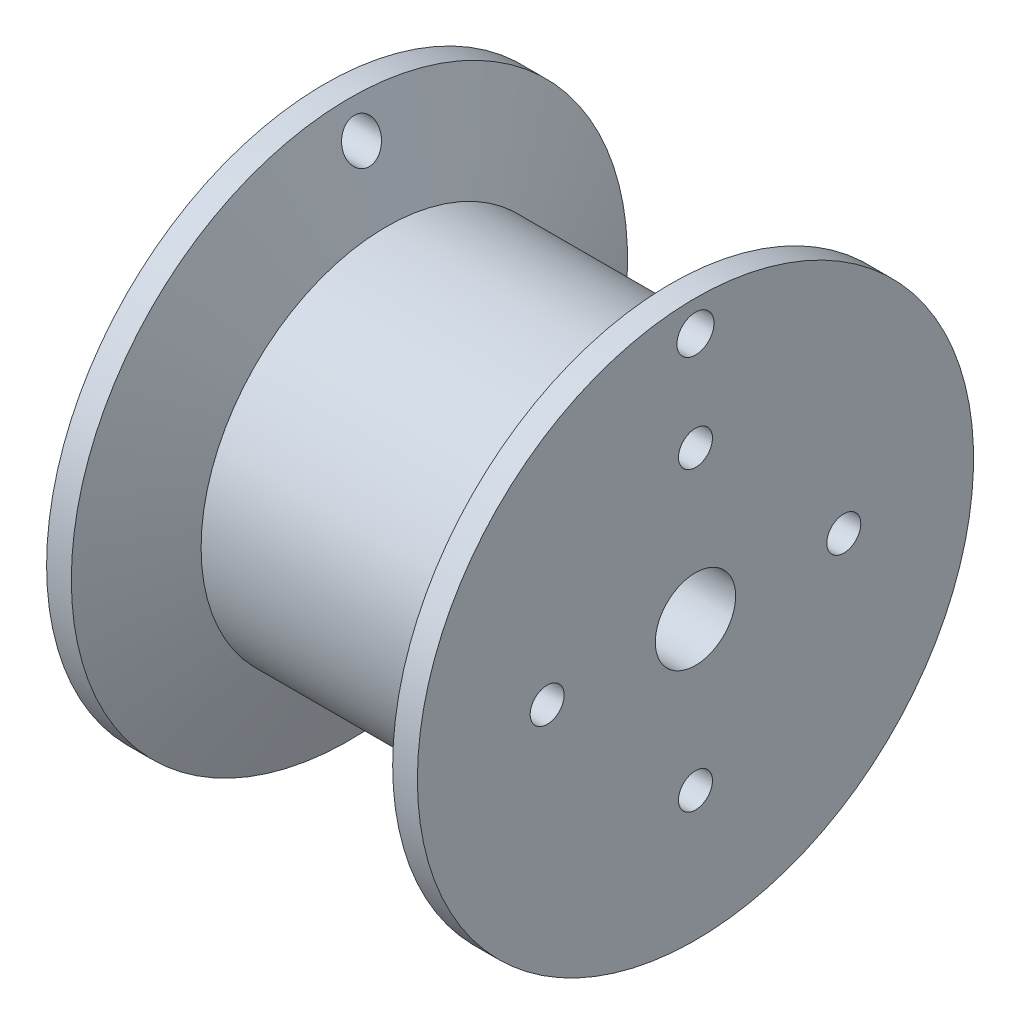
ISO-10303-21;
HEADER;
FILE_DESCRIPTION(('STEP AP214'),'2;1');
FILE_NAME('part.step','',(''),(''),'','','');
FILE_SCHEMA(('AUTOMOTIVE_DESIGN { 1 0 10303 214 1 1 1 1 }'));
ENDSEC;
DATA;
#1=APPLICATION_CONTEXT('core data for automotive mechanical design processes');
#2=APPLICATION_PROTOCOL_DEFINITION('international standard','automotive_design',2000,#1);
#3=PRODUCT_CONTEXT('',#1,'mechanical');
#4=PRODUCT('Part','Part','',(#3));
#5=PRODUCT_RELATED_PRODUCT_CATEGORY('part','',(#4));
#6=PRODUCT_DEFINITION_FORMATION('','',#4);
#7=PRODUCT_DEFINITION_CONTEXT('part definition',#1,'design');
#8=PRODUCT_DEFINITION('design','',#6,#7);
#9=PRODUCT_DEFINITION_SHAPE('','',#8);
#10=(LENGTH_UNIT() NAMED_UNIT(*) SI_UNIT(.MILLI.,.METRE.));
#11=(NAMED_UNIT(*) PLANE_ANGLE_UNIT() SI_UNIT($,.RADIAN.));
#12=(NAMED_UNIT(*) SI_UNIT($,.STERADIAN.) SOLID_ANGLE_UNIT());
#13=UNCERTAINTY_MEASURE_WITH_UNIT(LENGTH_MEASURE(1.E-05),#10,'distance_accuracy_value','');
#14=(GEOMETRIC_REPRESENTATION_CONTEXT(3) GLOBAL_UNCERTAINTY_ASSIGNED_CONTEXT((#13)) GLOBAL_UNIT_ASSIGNED_CONTEXT((#10,
#11,#12)) REPRESENTATION_CONTEXT('',''));
#15=CARTESIAN_POINT('',(0.,0.,0.));
#16=DIRECTION('',(0.,0.,1.));
#17=DIRECTION('',(1.,0.,0.));
#18=AXIS2_PLACEMENT_3D('',#15,#16,#17);
#19=CARTESIAN_POINT('',(0.,0.,0.));
#20=DIRECTION('',(-1.,0.,0.));
#21=DIRECTION('',(0.,0.,1.));
#22=AXIS2_PLACEMENT_3D('',#19,#20,#21);
#23=PLANE('',#22);
#24=CARTESIAN_POINT('',(0.,20.,0.));
#25=DIRECTION('',(1.,0.,0.));
#26=DIRECTION('',(0.,0.,-1.));
#27=AXIS2_PLACEMENT_3D('',#24,#25,#26);
#28=CIRCLE('',#27,1.5);
#29=CARTESIAN_POINT('',(0.,20.,-1.5));
#30=VERTEX_POINT('',#29);
#31=EDGE_CURVE('E151',#30,#30,#28,.T.);
#32=ORIENTED_EDGE('',*,*,#31,.T.);
#33=EDGE_LOOP('',(#32));
#34=FACE_BOUND('',#33,.T.);
#35=CARTESIAN_POINT('',(0.,0.,-12.));
#36=DIRECTION('',(1.,0.,0.));
#37=DIRECTION('',(0.,0.,-1.));
#38=AXIS2_PLACEMENT_3D('',#35,#36,#37);
#39=CIRCLE('',#38,1.375);
#40=CARTESIAN_POINT('',(0.,0.,-13.375));
#41=VERTEX_POINT('',#40);
#42=EDGE_CURVE('E155',#41,#41,#39,.T.);
#43=ORIENTED_EDGE('',*,*,#42,.T.);
#44=EDGE_LOOP('',(#43));
#45=FACE_BOUND('',#44,.T.);
#46=CARTESIAN_POINT('',(0.,-12.,0.));
#47=DIRECTION('',(1.,0.,0.));
#48=DIRECTION('',(0.,0.,-1.));
#49=AXIS2_PLACEMENT_3D('',#46,#47,#48);
#50=CIRCLE('',#49,1.375);
#51=CARTESIAN_POINT('',(0.,-12.,-1.37499999999992));
#52=VERTEX_POINT('',#51);
#53=EDGE_CURVE('E159',#52,#52,#50,.T.);
#54=ORIENTED_EDGE('',*,*,#53,.T.);
#55=EDGE_LOOP('',(#54));
#56=FACE_BOUND('',#55,.T.);
#57=CARTESIAN_POINT('',(0.,1.25693328198353E-13,12.));
#58=DIRECTION('',(1.,0.,0.));
#59=DIRECTION('',(0.,0.,-1.));
#60=AXIS2_PLACEMENT_3D('',#57,#58,#59);
#61=CIRCLE('',#60,1.375);
#62=CARTESIAN_POINT('',(0.,1.25693328198353E-13,10.625));
#63=VERTEX_POINT('',#62);
#64=EDGE_CURVE('E163',#63,#63,#61,.T.);
#65=ORIENTED_EDGE('',*,*,#64,.T.);
#66=EDGE_LOOP('',(#65));
#67=FACE_BOUND('',#66,.T.);
#68=CARTESIAN_POINT('',(0.,12.,0.));
#69=DIRECTION('',(1.,0.,0.));
#70=DIRECTION('',(0.,0.,-1.));
#71=AXIS2_PLACEMENT_3D('',#68,#69,#70);
#72=CIRCLE('',#71,1.375);
#73=CARTESIAN_POINT('',(0.,12.,-1.375));
#74=VERTEX_POINT('',#73);
#75=EDGE_CURVE('E167',#74,#74,#72,.T.);
#76=ORIENTED_EDGE('',*,*,#75,.T.);
#77=EDGE_LOOP('',(#76));
#78=FACE_BOUND('',#77,.T.);
#79=CARTESIAN_POINT('',(0.,0.,0.));
#80=DIRECTION('',(-1.,0.,0.));
#81=DIRECTION('',(0.,0.,1.));
#82=AXIS2_PLACEMENT_3D('',#79,#80,#81);
#83=CIRCLE('',#82,22.5);
#84=CARTESIAN_POINT('',(0.,0.,22.5));
#85=VERTEX_POINT('',#84);
#86=EDGE_CURVE('E85',#85,#85,#83,.T.);
#87=ORIENTED_EDGE('',*,*,#86,.T.);
#88=EDGE_LOOP('',(#87));
#89=FACE_BOUND('',#88,.T.);
#90=CARTESIAN_POINT('',(0.,0.,0.));
#91=DIRECTION('',(-1.,0.,0.));
#92=DIRECTION('',(0.,0.,1.));
#93=AXIS2_PLACEMENT_3D('',#90,#91,#92);
#94=CIRCLE('',#93,3.25);
#95=CARTESIAN_POINT('',(0.,0.,3.25));
#96=VERTEX_POINT('',#95);
#97=EDGE_CURVE('E10',#96,#96,#94,.T.);
#98=ORIENTED_EDGE('',*,*,#97,.F.);
#99=EDGE_LOOP('',(#98));
#100=FACE_BOUND('',#99,.T.);
#101=ADVANCED_FACE('F45',(#34,#45,#56,#67,#78,#89,#100),#23,.T.);
#102=CARTESIAN_POINT('',(0.,0.,0.));
#103=DIRECTION('',(-1.,0.,0.));
#104=DIRECTION('',(0.,0.,1.));
#105=AXIS2_PLACEMENT_3D('',#102,#103,#104);
#106=CYLINDRICAL_SURFACE('',#105,3.25);
#107=CARTESIAN_POINT('',(30.,0.,0.));
#108=DIRECTION('',(-1.,0.,0.));
#109=DIRECTION('',(0.,0.,1.));
#110=AXIS2_PLACEMENT_3D('',#107,#108,#109);
#111=CIRCLE('',#110,3.25);
#112=CARTESIAN_POINT('',(30.,0.,3.25));
#113=VERTEX_POINT('',#112);
#114=EDGE_CURVE('E58',#113,#113,#111,.T.);
#115=ORIENTED_EDGE('',*,*,#114,.F.);
#116=EDGE_LOOP('',(#115));
#117=FACE_BOUND('',#116,.T.);
#118=ORIENTED_EDGE('',*,*,#97,.T.);
#119=EDGE_LOOP('',(#118));
#120=FACE_BOUND('',#119,.T.);
#121=ADVANCED_FACE('F140',(#117,#120),#106,.F.);
#122=CARTESIAN_POINT('',(30.,0.,0.));
#123=DIRECTION('',(-1.,0.,0.));
#124=DIRECTION('',(0.,0.,1.));
#125=AXIS2_PLACEMENT_3D('',#122,#123,#124);
#126=PLANE('',#125);
#127=CARTESIAN_POINT('',(30.,20.,0.));
#128=DIRECTION('',(1.,0.,0.));
#129=DIRECTION('',(0.,0.,-1.));
#130=AXIS2_PLACEMENT_3D('',#127,#128,#129);
#131=CIRCLE('',#130,1.5);
#132=CARTESIAN_POINT('',(30.,20.,-1.5));
#133=VERTEX_POINT('',#132);
#134=EDGE_CURVE('E176',#133,#133,#131,.T.);
#135=ORIENTED_EDGE('',*,*,#134,.F.);
#136=EDGE_LOOP('',(#135));
#137=FACE_BOUND('',#136,.T.);
#138=CARTESIAN_POINT('',(30.,0.,-12.));
#139=DIRECTION('',(1.,0.,0.));
#140=DIRECTION('',(0.,0.,-1.));
#141=AXIS2_PLACEMENT_3D('',#138,#139,#140);
#142=CIRCLE('',#141,1.375);
#143=CARTESIAN_POINT('',(30.,0.,-13.375));
#144=VERTEX_POINT('',#143);
#145=EDGE_CURVE('E180',#144,#144,#142,.T.);
#146=ORIENTED_EDGE('',*,*,#145,.F.);
#147=EDGE_LOOP('',(#146));
#148=FACE_BOUND('',#147,.T.);
#149=CARTESIAN_POINT('',(30.,-12.,0.));
#150=DIRECTION('',(1.,0.,0.));
#151=DIRECTION('',(0.,0.,-1.));
#152=AXIS2_PLACEMENT_3D('',#149,#150,#151);
#153=CIRCLE('',#152,1.375);
#154=CARTESIAN_POINT('',(30.,-12.,-1.37499999999992));
#155=VERTEX_POINT('',#154);
#156=EDGE_CURVE('E181',#155,#155,#153,.T.);
#157=ORIENTED_EDGE('',*,*,#156,.F.);
#158=EDGE_LOOP('',(#157));
#159=FACE_BOUND('',#158,.T.);
#160=CARTESIAN_POINT('',(30.,1.25693328198353E-13,12.));
#161=DIRECTION('',(1.,0.,0.));
#162=DIRECTION('',(0.,0.,-1.));
#163=AXIS2_PLACEMENT_3D('',#160,#161,#162);
#164=CIRCLE('',#163,1.375);
#165=CARTESIAN_POINT('',(30.,1.25693328198353E-13,10.625));
#166=VERTEX_POINT('',#165);
#167=EDGE_CURVE('E192',#166,#166,#164,.T.);
#168=ORIENTED_EDGE('',*,*,#167,.F.);
#169=EDGE_LOOP('',(#168));
#170=FACE_BOUND('',#169,.T.);
#171=CARTESIAN_POINT('',(30.,12.,0.));
#172=DIRECTION('',(1.,0.,0.));
#173=DIRECTION('',(0.,0.,-1.));
#174=AXIS2_PLACEMENT_3D('',#171,#172,#173);
#175=CIRCLE('',#174,1.375);
#176=CARTESIAN_POINT('',(30.,12.,-1.375));
#177=VERTEX_POINT('',#176);
#178=EDGE_CURVE('E97',#177,#177,#175,.T.);
#179=ORIENTED_EDGE('',*,*,#178,.F.);
#180=EDGE_LOOP('',(#179));
#181=FACE_BOUND('',#180,.T.);
#182=CARTESIAN_POINT('',(30.,0.,0.));
#183=DIRECTION('',(-1.,0.,0.));
#184=DIRECTION('',(0.,0.,1.));
#185=AXIS2_PLACEMENT_3D('',#182,#183,#184);
#186=CIRCLE('',#185,22.5);
#187=CARTESIAN_POINT('',(30.,0.,22.5));
#188=VERTEX_POINT('',#187);
#189=EDGE_CURVE('E63',#188,#188,#186,.T.);
#190=ORIENTED_EDGE('',*,*,#189,.F.);
#191=EDGE_LOOP('',(#190));
#192=FACE_BOUND('',#191,.T.);
#193=ORIENTED_EDGE('',*,*,#114,.T.);
#194=EDGE_LOOP('',(#193));
#195=FACE_BOUND('',#194,.T.);
#196=ADVANCED_FACE('F146',(#137,#148,#159,#170,#181,#192,#195),#126,.F.);
#197=CARTESIAN_POINT('',(0.,0.,0.));
#198=DIRECTION('',(-1.,0.,0.));
#199=DIRECTION('',(0.,0.,1.));
#200=AXIS2_PLACEMENT_3D('',#197,#198,#199);
#201=CYLINDRICAL_SURFACE('',#200,22.5);
#202=ORIENTED_EDGE('',*,*,#189,.T.);
#203=EDGE_LOOP('',(#202));
#204=FACE_BOUND('',#203,.T.);
#205=CARTESIAN_POINT('',(28.,0.,0.));
#206=DIRECTION('',(-1.,0.,0.));
#207=DIRECTION('',(0.,0.,1.));
#208=AXIS2_PLACEMENT_3D('',#205,#206,#207);
#209=CIRCLE('',#208,22.5);
#210=CARTESIAN_POINT('',(28.,0.,22.5));
#211=VERTEX_POINT('',#210);
#212=EDGE_CURVE('E69',#211,#211,#209,.T.);
#213=ORIENTED_EDGE('',*,*,#212,.F.);
#214=EDGE_LOOP('',(#213));
#215=FACE_BOUND('',#214,.T.);
#216=ADVANCED_FACE('F126',(#204,#215),#201,.T.);
#217=CARTESIAN_POINT('',(24.9958903758005,0.,0.));
#218=DIRECTION('',(1.,0.,0.));
#219=DIRECTION('',(0.,0.,-1.));
#220=AXIS2_PLACEMENT_3D('',#217,#218,#219);
#221=CONICAL_SURFACE('',#220,15.,1.18981766835673);
#222=CARTESIAN_POINT('',(26.548660737884,18.8519152489608,-0.965350405686269));
#223=CARTESIAN_POINT('',(26.5270950918098,18.8010989906716,-0.904912370374675));
#224=CARTESIAN_POINT('',(26.5073231410361,18.7547277419584,-0.840054523288111));
#225=CARTESIAN_POINT('',(26.4721368591874,18.6724622779571,-0.702880603910835));
#226=CARTESIAN_POINT('',(26.4567240095899,18.6365716244538,-0.630562007390076));
#227=CARTESIAN_POINT('',(26.4309154096814,18.5766002621588,-0.480108551352483));
#228=CARTESIAN_POINT('',(26.4205319492071,18.5525484805833,-0.401959977544328));
#229=CARTESIAN_POINT('',(26.4053609433747,18.5174415456153,-0.242277211565463));
#230=CARTESIAN_POINT('',(26.4005717420047,18.506382546095,-0.160744028710835));
#231=CARTESIAN_POINT('',(26.3969148377157,18.4979365962751,-0.000213626959446605));
#232=CARTESIAN_POINT('',(26.3978118459397,18.5000063936323,0.0787500894408113));
#233=CARTESIAN_POINT('',(26.4049327198916,18.516458896653,0.235129881356269));
#234=CARTESIAN_POINT('',(26.4111561744107,18.5308406518168,0.312546075870122));
#235=CARTESIAN_POINT('',(26.4285199669858,18.5710593582927,0.462706991867706));
#236=CARTESIAN_POINT('',(26.4395986242357,18.596752625577,0.535497602727219));
#237=CARTESIAN_POINT('',(26.4661740349133,18.6585806504062,0.675619474582387));
#238=CARTESIAN_POINT('',(26.4816714194845,18.6947168995718,0.742949953920907));
#239=CARTESIAN_POINT('',(26.517224354933,18.7779430364797,0.873392397523405));
#240=CARTESIAN_POINT('',(26.537445869057,18.8254337502423,0.936202742871447));
#241=CARTESIAN_POINT('',(26.5812937244748,18.9289010517028,1.05301514903108));
#242=CARTESIAN_POINT('',(26.6049210962857,18.9848802080327,1.1070145333121));
#243=CARTESIAN_POINT('',(26.6566966126494,19.1081923911989,1.20894328577004));
#244=CARTESIAN_POINT('',(26.6850504325792,19.1760606301521,1.25612050703134));
#245=CARTESIAN_POINT('',(26.7439411518622,19.317871055293,1.33844270012161));
#246=CARTESIAN_POINT('',(26.7744788026975,19.3918153336351,1.37358350575972));
#247=CARTESIAN_POINT('',(26.8391936218264,19.5494904379042,1.43340803235432));
#248=CARTESIAN_POINT('',(26.8734736171857,19.6335414808882,1.45713880004379));
#249=CARTESIAN_POINT('',(26.9426327418453,19.8042501344054,1.48971065903545));
#250=CARTESIAN_POINT('',(26.9775120310033,19.8909084451888,1.4985477132414));
#251=CARTESIAN_POINT('',(27.0483976045282,20.0681808302907,1.50117543097238));
#252=CARTESIAN_POINT('',(27.0843909228913,20.158810433202,1.49432944655635));
#253=CARTESIAN_POINT('',(27.1550442198677,20.3378679592238,1.46426998129935));
#254=CARTESIAN_POINT('',(27.1897041216839,20.42629575542,1.44105555921555));
#255=CARTESIAN_POINT('',(27.2564748491918,20.5976670685766,1.37878495664299));
#256=CARTESIAN_POINT('',(27.2886013473936,20.6806436690968,1.33983711858509));
#257=CARTESIAN_POINT('',(27.3495855736808,20.8389860254071,1.24680657449527));
#258=CARTESIAN_POINT('',(27.3784441298567,20.9143537087556,1.19272771474625));
#259=CARTESIAN_POINT('',(27.4305986082688,21.051168983859,1.0737103697595));
#260=CARTESIAN_POINT('',(27.4540993385377,21.1131213522813,1.00944295230126));
#261=CARTESIAN_POINT('',(27.4964711865908,21.2251999256443,0.869986112682629));
#262=CARTESIAN_POINT('',(27.5153443924069,21.2753314639884,0.794801640990418));
#263=CARTESIAN_POINT('',(27.5466480531316,21.3586821709384,0.641168195438736));
#264=CARTESIAN_POINT('',(27.5594292050518,21.3928192069398,0.563288372462257));
#265=CARTESIAN_POINT('',(27.5798919883571,21.4475473828289,0.402277597212367));
#266=CARTESIAN_POINT('',(27.5875755798312,21.4681437292892,0.319148676777761));
#267=CARTESIAN_POINT('',(27.5972753981164,21.4941555504905,0.154987376308692));
#268=CARTESIAN_POINT('',(27.599582601318,21.5003504030304,0.0740948517514601));
#269=CARTESIAN_POINT('',(27.5993101460299,21.4996191278969,-0.0876157452366037));
#270=CARTESIAN_POINT('',(27.5967313138857,21.4926952189202,-0.1684338279446));
#271=CARTESIAN_POINT('',(27.5868860913258,21.4662961933706,-0.325906807009185));
#272=CARTESIAN_POINT('',(27.5797207108997,21.447091545461,-0.402613712129492));
#273=CARTESIAN_POINT('',(27.5610352249039,21.3971124792672,-0.551589340592472));
#274=CARTESIAN_POINT('',(27.5495149398305,21.3663375840723,-0.623857880848559));
#275=CARTESIAN_POINT('',(27.5222281769004,21.2936445986029,-0.763404475460264));
#276=CARTESIAN_POINT('',(27.5063877837848,21.2515327160723,-0.830566866205378));
#277=CARTESIAN_POINT('',(27.4710305473682,21.1578605897378,-0.956840166183565));
#278=CARTESIAN_POINT('',(27.4515129851635,21.1062984984276,-1.01594949710539));
#279=CARTESIAN_POINT('',(27.4082771595622,20.9925390979242,-1.12762125519741));
#280=CARTESIAN_POINT('',(27.3843983459717,20.9299406167991,-1.17971237566626));
#281=CARTESIAN_POINT('',(27.3338090617026,20.7979572369436,-1.27270867505271));
#282=CARTESIAN_POINT('',(27.3070977916763,20.7285704229075,-1.31361068457062));
#283=CARTESIAN_POINT('',(27.2497015488879,20.5802562534366,-1.38583349923056));
#284=CARTESIAN_POINT('',(27.218871480269,20.5010022925616,-1.41636845423272));
#285=CARTESIAN_POINT('',(27.1555218068842,20.3391217887994,-1.46359535293492));
#286=CARTESIAN_POINT('',(27.1230017658946,20.2564943763322,-1.48028370343244));
#287=CARTESIAN_POINT('',(27.0551725330886,20.085221789398,-1.50019487889002));
#288=CARTESIAN_POINT('',(27.0198099355154,19.9965017556826,-1.50259732139461));
#289=CARTESIAN_POINT('',(26.94899345721,19.8200165143565,-1.49178649797995));
#290=CARTESIAN_POINT('',(26.9135395425431,19.7322517547019,-1.47856619969704));
#291=CARTESIAN_POINT('',(26.842597109441,19.5577936410179,-1.43621852844277));
#292=CARTESIAN_POINT('',(26.8071324884071,19.4711900541208,-1.40667958776392));
#293=CARTESIAN_POINT('',(26.7382907653117,19.3041688686715,-1.33197962111093));
#294=CARTESIAN_POINT('',(26.7049114082727,19.2237445654925,-1.28683582781054));
#295=CARTESIAN_POINT('',(26.6504288568227,19.0932490490134,-1.19674357696969));
#296=CARTESIAN_POINT('',(26.628524194538,19.0410275619076,-1.15535293344676));
#297=CARTESIAN_POINT('',(26.5868628318,18.9420926272714,-1.06550181862589));
#298=CARTESIAN_POINT('',(26.5671057151489,18.8953781123319,-1.01704272148437));
#299=CARTESIAN_POINT('',(26.548660737884,18.8519152489608,-0.965350405686269));
#300=B_SPLINE_CURVE_WITH_KNOTS('',3,(#222,#223,#224,#225,#226,#227,#228,#229,#230,#231,#232,
#233,#234,#235,#236,#237,#238,#239,#240,#241,#242,#243,#244,#245,#246,#247,#248,#249,#250,#251,
#252,#253,#254,#255,#256,#257,#258,#259,#260,#261,#262,#263,#264,#265,#266,#267,#268,#269,#270,
#271,#272,#273,#274,#275,#276,#277,#278,#279,#280,#281,#282,#283,#284,#285,#286,#287,#288,#289,
#290,#291,#292,#293,#294,#295,#296,#297,#298,#299),.UNSPECIFIED.,.T.,.F.,(4,2,2,2,2,2,2,2,2,2,2,
2,2,2,2,2,2,2,2,2,2,2,2,2,2,2,2,2,2,2,2,2,2,2,2,2,2,2,4),(0.,0.245334630595863,0.4907525403243,
0.736767166153218,0.982708948284878,1.21854229014447,1.45435742699297,1.68725987124532,
1.92019559851593,2.16304787030327,2.40597377721949,2.66700146092912,2.92811940363396,
3.20833781909008,3.48863217845878,3.78050551498878,4.0723956366328,4.36230912480597,
4.65214898425674,4.9276237264189,5.20297393914602,5.45961030583769,5.71614793468023,
5.95844212821537,6.20069534765973,6.43778882560294,6.67489207730755,6.91633853187932,
7.15783223943819,7.41132663322882,7.6648927570345,7.93477462403105,8.20472650365624,
8.49004152103501,8.77548501801326,9.06847989450104,9.36115224058278,9.57102633374538,
9.78085968017348),.UNSPECIFIED.);
#301=CARTESIAN_POINT('',(26.548660737884,18.8519152489608,-0.965350405686269));
#302=VERTEX_POINT('',#301);
#303=EDGE_CURVE('E89',#302,#302,#300,.T.);
#304=ORIENTED_EDGE('',*,*,#303,.F.);
#305=EDGE_LOOP('',(#304));
#306=FACE_BOUND('',#305,.T.);
#307=ORIENTED_EDGE('',*,*,#212,.T.);
#308=EDGE_LOOP('',(#307));
#309=FACE_BOUND('',#308,.T.);
#310=CARTESIAN_POINT('',(24.9958903758005,0.,0.));
#311=DIRECTION('',(-1.,0.,0.));
#312=DIRECTION('',(0.,0.,1.));
#313=AXIS2_PLACEMENT_3D('',#310,#311,#312);
#314=CIRCLE('',#313,15.);
#315=CARTESIAN_POINT('',(24.9958903758005,0.,15.));
#316=VERTEX_POINT('',#315);
#317=EDGE_CURVE('E73',#316,#316,#314,.T.);
#318=ORIENTED_EDGE('',*,*,#317,.F.);
#319=EDGE_LOOP('',(#318));
#320=FACE_BOUND('',#319,.T.);
#321=ADVANCED_FACE('F99',(#306,#309,#320),#221,.T.);
#322=CARTESIAN_POINT('',(0.,0.,0.));
#323=DIRECTION('',(-1.,0.,0.));
#324=DIRECTION('',(0.,0.,1.));
#325=AXIS2_PLACEMENT_3D('',#322,#323,#324);
#326=CYLINDRICAL_SURFACE('',#325,15.);
#327=ORIENTED_EDGE('',*,*,#317,.T.);
#328=EDGE_LOOP('',(#327));
#329=FACE_BOUND('',#328,.T.);
#330=CARTESIAN_POINT('',(5.,0.,0.));
#331=DIRECTION('',(-1.,0.,0.));
#332=DIRECTION('',(0.,0.,1.));
#333=AXIS2_PLACEMENT_3D('',#330,#331,#332);
#334=CIRCLE('',#333,15.);
#335=CARTESIAN_POINT('',(5.,0.,15.));
#336=VERTEX_POINT('',#335);
#337=EDGE_CURVE('E77',#336,#336,#334,.T.);
#338=ORIENTED_EDGE('',*,*,#337,.F.);
#339=EDGE_LOOP('',(#338));
#340=FACE_BOUND('',#339,.T.);
#341=ADVANCED_FACE('F129',(#329,#340),#326,.T.);
#342=CARTESIAN_POINT('',(2.,0.,0.));
#343=DIRECTION('',(-1.,0.,0.));
#344=DIRECTION('',(0.,0.,1.));
#345=AXIS2_PLACEMENT_3D('',#342,#343,#344);
#346=CONICAL_SURFACE('',#345,22.5,1.19028994968253);
#347=CARTESIAN_POINT('',(3.38833994583567,18.9964634021693,-1.11486090218989));
#348=CARTESIAN_POINT('',(3.36032874573186,19.0630924662456,-1.17483138985137));
#349=CARTESIAN_POINT('',(3.330366366289,19.1347343510672,-1.22847679416503));
#350=CARTESIAN_POINT('',(3.26768435429697,19.2855813999704,-1.32193450160664));
#351=CARTESIAN_POINT('',(3.23495886813638,19.3648026706543,-1.36171647292328));
#352=CARTESIAN_POINT('',(3.16793420193252,19.5281461240624,-1.42655139700716));
#353=CARTESIAN_POINT('',(3.13363955769797,19.612254349881,-1.45164422809696));
#354=CARTESIAN_POINT('',(3.06439011777213,19.7832351922241,-1.48681916370727));
#355=CARTESIAN_POINT('',(3.02943558267226,19.8701067264294,-1.49690707310832));
#356=CARTESIAN_POINT('',(2.95850613004453,20.0475502308262,-1.50196427887952));
#357=CARTESIAN_POINT('',(2.92254005401684,20.1381423622467,-1.49637333980972));
#358=CARTESIAN_POINT('',(2.85185726679518,20.3173406302729,-1.46884760367035));
#359=CARTESIAN_POINT('',(2.8171407739577,20.4059464187676,-1.44690996451759));
#360=CARTESIAN_POINT('',(2.75010828496657,20.5780616650082,-1.38712043337623));
#361=CARTESIAN_POINT('',(2.71778152653489,20.6615936253221,-1.34934574550671));
#362=CARTESIAN_POINT('',(2.65632434110572,20.8212466638687,-1.25856235870246));
#363=CARTESIAN_POINT('',(2.62719310935595,20.8973696074201,-1.20555750751502));
#364=CARTESIAN_POINT('',(2.57439971878157,21.0359492983118,-1.08841238496749));
#365=CARTESIAN_POINT('',(2.55054179087305,21.0988875206049,-1.02493099937661));
#366=CARTESIAN_POINT('',(2.50741190452596,21.2130603692429,-0.88684748247048));
#367=CARTESIAN_POINT('',(2.48813788743459,21.2643002489451,-0.812250367850581));
#368=CARTESIAN_POINT('',(2.45602456462216,21.3498867318399,-0.659504850050576));
#369=CARTESIAN_POINT('',(2.44283812519468,21.3851417518008,-0.581938206204382));
#370=CARTESIAN_POINT('',(2.42155454132308,21.4421268957565,-0.421332445596416));
#371=CARTESIAN_POINT('',(2.41345542244701,21.463862266809,-0.338295465760112));
#372=CARTESIAN_POINT('',(2.40295788118047,21.4920480181395,-0.17416642839571));
#373=CARTESIAN_POINT('',(2.40026388570611,21.4992908413647,-0.0932285306405159));
#374=CARTESIAN_POINT('',(2.39977323657238,21.5006093926254,0.0687624871792846));
#375=CARTESIAN_POINT('',(2.40197570813918,21.494687472596,0.149815584077707));
#376=CARTESIAN_POINT('',(2.41109254356334,21.4702049399456,0.30780461963901));
#377=CARTESIAN_POINT('',(2.41789842663186,21.4519353123625,0.384792286497037));
#378=CARTESIAN_POINT('',(2.43588446297874,21.4037491561428,0.534482545323325));
#379=CARTESIAN_POINT('',(2.4470647685934,21.3738322218968,0.607184987960088));
#380=CARTESIAN_POINT('',(2.47367404374191,21.3028211135276,0.747631849422615));
#381=CARTESIAN_POINT('',(2.48917129555505,21.261547447277,0.815272338748659));
#382=CARTESIAN_POINT('',(2.52386770520085,21.1694559894837,0.942630471958059));
#383=CARTESIAN_POINT('',(2.54306756398081,21.1186363908304,1.00234661204911));
#384=CARTESIAN_POINT('',(2.58566225629071,21.006344590027,1.1153101164924));
#385=CARTESIAN_POINT('',(2.60921567297265,20.9444745661656,1.16810175240673));
#386=CARTESIAN_POINT('',(2.6591884427274,20.8138301866553,1.26261098239095));
#387=CARTESIAN_POINT('',(2.68560858912306,20.7450539202059,1.30432549997456));
#388=CARTESIAN_POINT('',(2.7424347936294,20.5978947674455,1.37830653344047));
#389=CARTESIAN_POINT('',(2.77298772334576,20.5191787781224,1.40979775484243));
#390=CARTESIAN_POINT('',(2.83583387526435,20.3582219551851,1.45902917552126));
#391=CARTESIAN_POINT('',(2.86812761023373,20.2759800844724,1.47676529919788));
#392=CARTESIAN_POINT('',(2.93557196596368,20.1052811686072,1.49891324321435));
#393=CARTESIAN_POINT('',(2.97078000666304,20.0167389648672,1.50249884950038));
#394=CARTESIAN_POINT('',(3.04135069213828,19.8404457845269,1.49409985667506));
#395=CARTESIAN_POINT('',(3.07671337051575,19.752694994023,1.48211168689327));
#396=CARTESIAN_POINT('',(3.147594844694,19.5779651943411,1.44226688563699));
#397=CARTESIAN_POINT('',(3.18309112421774,19.491073978702,1.41398237271421));
#398=CARTESIAN_POINT('',(3.25212000492266,19.3231957552582,1.34174688397671));
#399=CARTESIAN_POINT('',(3.2856525918522,19.242208790303,1.29779579447722));
#400=CARTESIAN_POINT('',(3.34889762721829,19.0903729743531,1.19614086031051));
#401=CARTESIAN_POINT('',(3.37867441257931,19.0193500029188,1.13873815702148));
#402=CARTESIAN_POINT('',(3.43398190105836,18.8881037665853,1.01097119107371));
#403=CARTESIAN_POINT('',(3.4595143384051,18.8278760899678,0.94061224719004));
#404=CARTESIAN_POINT('',(3.50357455127801,18.7243656088192,0.793895660678507));
#405=CARTESIAN_POINT('',(3.52245708109405,18.6802177185863,0.718256017860904));
#406=CARTESIAN_POINT('',(3.5545127537151,18.605472071682,0.559445082196002));
#407=CARTESIAN_POINT('',(3.56768939817318,18.5748660042578,0.47627844659936));
#408=CARTESIAN_POINT('',(3.58678469639095,18.5305745309539,0.312122886868115));
#409=CARTESIAN_POINT('',(3.59320722246544,18.515713691025,0.231508600419587));
#410=CARTESIAN_POINT('',(3.6002824240932,18.4993448126774,0.0686984435803004));
#411=CARTESIAN_POINT('',(3.60093740295182,18.4978314438638,-0.0134967823085911));
#412=CARTESIAN_POINT('',(3.59655960595315,18.507957203538,-0.17282052118772));
#413=CARTESIAN_POINT('',(3.59180582314801,18.5189511789854,-0.249998951848424));
#414=CARTESIAN_POINT('',(3.5772857254644,18.552599250225,-0.401294462222181));
#415=CARTESIAN_POINT('',(3.56751805584165,18.5752564974196,-0.475410708686794));
#416=CARTESIAN_POINT('',(3.54329965721668,18.631598907209,-0.619278217793555));
#417=CARTESIAN_POINT('',(3.52880702531569,18.6653827735963,-0.688983499826431));
#418=CARTESIAN_POINT('',(3.49576905136086,18.7426892327952,-0.821615483913962));
#419=CARTESIAN_POINT('',(3.47722800646374,18.7862015006342,-0.88454926858388));
#420=CARTESIAN_POINT('',(3.44642329749097,18.8588139018905,-0.974306138099112));
#421=CARTESIAN_POINT('',(3.43537740221275,18.8849038662915,-1.00404848445297));
#422=CARTESIAN_POINT('',(3.41245856641345,18.9391644801478,-1.06121698007451));
#423=CARTESIAN_POINT('',(3.40058571182834,18.9673349134233,-1.08864336935849));
#424=CARTESIAN_POINT('',(3.38833994583567,18.9964634021693,-1.11486090218989));
#425=B_SPLINE_CURVE_WITH_KNOTS('',3,(#347,#348,#349,#350,#351,#352,#353,#354,#355,#356,#357,
#358,#359,#360,#361,#362,#363,#364,#365,#366,#367,#368,#369,#370,#371,#372,#373,#374,#375,#376,
#377,#378,#379,#380,#381,#382,#383,#384,#385,#386,#387,#388,#389,#390,#391,#392,#393,#394,#395,
#396,#397,#398,#399,#400,#401,#402,#403,#404,#405,#406,#407,#408,#409,#410,#411,#412,#413,#414,
#415,#416,#417,#418,#419,#420,#421,#422,#423,#424),.UNSPECIFIED.,.T.,.F.,(4,2,2,2,2,2,2,2,2,2,2,
2,2,2,2,2,2,2,2,2,2,2,2,2,2,2,2,2,2,2,2,2,2,2,2,2,2,2,4),(0.,0.28159458360027,0.563801456049059,
0.845238592281219,1.12656682196313,1.41807419970518,1.70963227156778,1.99978525489225,
2.28986499834523,2.56598048085353,2.84197172362754,3.09928974600445,3.35650783928352,
3.59922867637234,3.84190615387737,4.07905539016322,4.31621288574575,4.55735831703491,
4.79854944490122,5.05146833292197,5.30445739168346,5.57363363900746,5.84288961212583,
6.12765280160421,6.41248129155748,6.70515314267632,6.99782711761668,7.28448736461193,
7.57103019359177,7.83837008972933,8.10554568834067,8.35095334310748,8.5962629883756,
8.82947107391743,9.0627422051088,9.2981410702466,9.53329127730585,9.65640985885972,
9.77951566520827),.UNSPECIFIED.);
#426=CARTESIAN_POINT('',(3.38833994583567,18.9964634021693,-1.11486090218989));
#427=VERTEX_POINT('',#426);
#428=EDGE_CURVE('E48',#427,#427,#425,.T.);
#429=ORIENTED_EDGE('',*,*,#428,.F.);
#430=EDGE_LOOP('',(#429));
#431=FACE_BOUND('',#430,.T.);
#432=ORIENTED_EDGE('',*,*,#337,.T.);
#433=EDGE_LOOP('',(#432));
#434=FACE_BOUND('',#433,.T.);
#435=CARTESIAN_POINT('',(2.,0.,0.));
#436=DIRECTION('',(-1.,0.,0.));
#437=DIRECTION('',(0.,0.,1.));
#438=AXIS2_PLACEMENT_3D('',#435,#436,#437);
#439=CIRCLE('',#438,22.5);
#440=CARTESIAN_POINT('',(2.,0.,22.5));
#441=VERTEX_POINT('',#440);
#442=EDGE_CURVE('E81',#441,#441,#439,.T.);
#443=ORIENTED_EDGE('',*,*,#442,.F.);
#444=EDGE_LOOP('',(#443));
#445=FACE_BOUND('',#444,.T.);
#446=ADVANCED_FACE('F124',(#431,#434,#445),#346,.T.);
#447=ORIENTED_EDGE('',*,*,#442,.T.);
#448=EDGE_LOOP('',(#447));
#449=FACE_BOUND('',#448,.T.);
#450=ORIENTED_EDGE('',*,*,#86,.F.);
#451=EDGE_LOOP('',(#450));
#452=FACE_BOUND('',#451,.T.);
#453=ADVANCED_FACE('F109',(#449,#452),#201,.T.);
#454=CARTESIAN_POINT('',(0.,20.,0.));
#455=DIRECTION('',(1.,0.,0.));
#456=DIRECTION('',(0.,0.,-1.));
#457=AXIS2_PLACEMENT_3D('',#454,#455,#456);
#458=CYLINDRICAL_SURFACE('',#457,1.5);
#459=ORIENTED_EDGE('',*,*,#428,.T.);
#460=EDGE_LOOP('',(#459));
#461=FACE_BOUND('',#460,.T.);
#462=ORIENTED_EDGE('',*,*,#31,.F.);
#463=EDGE_LOOP('',(#462));
#464=FACE_BOUND('',#463,.T.);
#465=ADVANCED_FACE('F103',(#461,#464),#458,.F.);
#466=ORIENTED_EDGE('',*,*,#303,.T.);
#467=EDGE_LOOP('',(#466));
#468=FACE_BOUND('',#467,.T.);
#469=ORIENTED_EDGE('',*,*,#134,.T.);
#470=EDGE_LOOP('',(#469));
#471=FACE_BOUND('',#470,.T.);
#472=ADVANCED_FACE('F108',(#468,#471),#458,.F.);
#473=CARTESIAN_POINT('',(0.,12.,0.));
#474=DIRECTION('',(1.,0.,0.));
#475=DIRECTION('',(0.,0.,-1.));
#476=AXIS2_PLACEMENT_3D('',#473,#474,#475);
#477=CYLINDRICAL_SURFACE('',#476,1.375);
#478=ORIENTED_EDGE('',*,*,#75,.F.);
#479=EDGE_LOOP('',(#478));
#480=FACE_BOUND('',#479,.T.);
#481=ORIENTED_EDGE('',*,*,#178,.T.);
#482=EDGE_LOOP('',(#481));
#483=FACE_BOUND('',#482,.T.);
#484=ADVANCED_FACE('F119',(#480,#483),#477,.F.);
#485=CARTESIAN_POINT('',(0.,1.25693328198353E-13,12.));
#486=DIRECTION('',(1.,0.,0.));
#487=DIRECTION('',(0.,0.,-1.));
#488=AXIS2_PLACEMENT_3D('',#485,#486,#487);
#489=CYLINDRICAL_SURFACE('',#488,1.375);
#490=ORIENTED_EDGE('',*,*,#64,.F.);
#491=EDGE_LOOP('',(#490));
#492=FACE_BOUND('',#491,.T.);
#493=ORIENTED_EDGE('',*,*,#167,.T.);
#494=EDGE_LOOP('',(#493));
#495=FACE_BOUND('',#494,.T.);
#496=ADVANCED_FACE('F111',(#492,#495),#489,.F.);
#497=CARTESIAN_POINT('',(0.,-12.,0.));
#498=DIRECTION('',(1.,0.,0.));
#499=DIRECTION('',(0.,0.,-1.));
#500=AXIS2_PLACEMENT_3D('',#497,#498,#499);
#501=CYLINDRICAL_SURFACE('',#500,1.375);
#502=ORIENTED_EDGE('',*,*,#53,.F.);
#503=EDGE_LOOP('',(#502));
#504=FACE_BOUND('',#503,.T.);
#505=ORIENTED_EDGE('',*,*,#156,.T.);
#506=EDGE_LOOP('',(#505));
#507=FACE_BOUND('',#506,.T.);
#508=ADVANCED_FACE('F117',(#504,#507),#501,.F.);
#509=CARTESIAN_POINT('',(0.,0.,-12.));
#510=DIRECTION('',(1.,0.,0.));
#511=DIRECTION('',(0.,0.,-1.));
#512=AXIS2_PLACEMENT_3D('',#509,#510,#511);
#513=CYLINDRICAL_SURFACE('',#512,1.375);
#514=ORIENTED_EDGE('',*,*,#42,.F.);
#515=EDGE_LOOP('',(#514));
#516=FACE_BOUND('',#515,.T.);
#517=ORIENTED_EDGE('',*,*,#145,.T.);
#518=EDGE_LOOP('',(#517));
#519=FACE_BOUND('',#518,.T.);
#520=ADVANCED_FACE('F113',(#516,#519),#513,.F.);
#521=CLOSED_SHELL('',(#101,#121,#196,#216,#321,#341,#446,#453,#465,#472,#484,#496,#508,#520));
#522=MANIFOLD_SOLID_BREP('B2',#521);
#523=ADVANCED_BREP_SHAPE_REPRESENTATION('',(#18,#522),#14);
#524=SHAPE_DEFINITION_REPRESENTATION(#9,#523);
ENDSEC;
END-ISO-10303-21;
